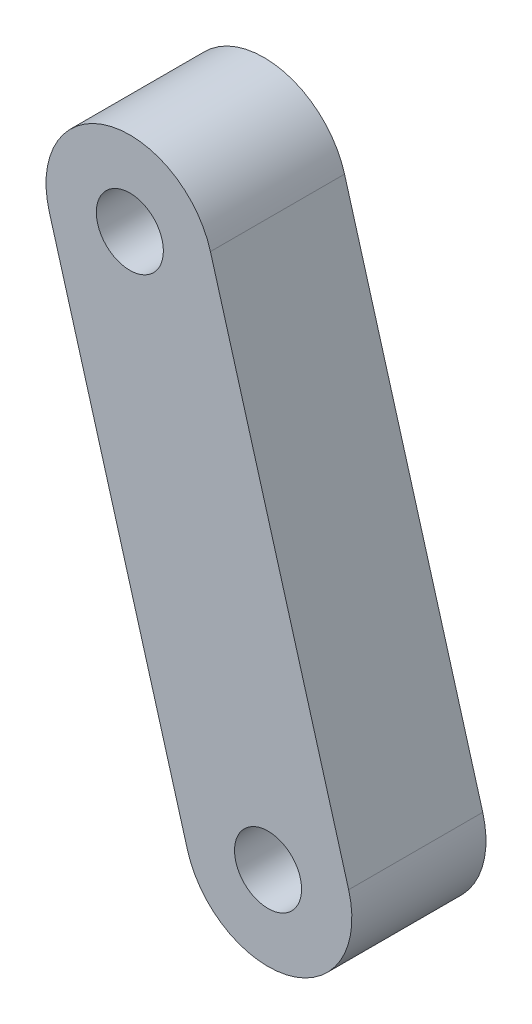
ISO-10303-21;
HEADER;
FILE_DESCRIPTION(('STEP AP214'),'2;1');
FILE_NAME('part.step','',(''),(''),'','','');
FILE_SCHEMA(('AUTOMOTIVE_DESIGN { 1 0 10303 214 1 1 1 1 }'));
ENDSEC;
DATA;
#1=APPLICATION_CONTEXT('core data for automotive mechanical design processes');
#2=APPLICATION_PROTOCOL_DEFINITION('international standard','automotive_design',2000,#1);
#3=PRODUCT_CONTEXT('',#1,'mechanical');
#4=PRODUCT('Part','Part','',(#3));
#5=PRODUCT_RELATED_PRODUCT_CATEGORY('part','',(#4));
#6=PRODUCT_DEFINITION_FORMATION('','',#4);
#7=PRODUCT_DEFINITION_CONTEXT('part definition',#1,'design');
#8=PRODUCT_DEFINITION('design','',#6,#7);
#9=PRODUCT_DEFINITION_SHAPE('','',#8);
#10=(LENGTH_UNIT() NAMED_UNIT(*) SI_UNIT(.MILLI.,.METRE.));
#11=(NAMED_UNIT(*) PLANE_ANGLE_UNIT() SI_UNIT($,.RADIAN.));
#12=(NAMED_UNIT(*) SI_UNIT($,.STERADIAN.) SOLID_ANGLE_UNIT());
#13=UNCERTAINTY_MEASURE_WITH_UNIT(LENGTH_MEASURE(1.E-05),#10,'distance_accuracy_value','');
#14=(GEOMETRIC_REPRESENTATION_CONTEXT(3) GLOBAL_UNCERTAINTY_ASSIGNED_CONTEXT((#13)) GLOBAL_UNIT_ASSIGNED_CONTEXT((#10,
#11,#12)) REPRESENTATION_CONTEXT('',''));
#15=CARTESIAN_POINT('',(0.,0.,0.));
#16=DIRECTION('',(0.,0.,1.));
#17=DIRECTION('',(1.,0.,0.));
#18=AXIS2_PLACEMENT_3D('',#15,#16,#17);
#19=CARTESIAN_POINT('',(21.7327599565873,64.1663539899448,4.));
#20=DIRECTION('',(0.,0.,1.));
#21=DIRECTION('',(1.,0.,0.));
#22=AXIS2_PLACEMENT_3D('',#19,#20,#21);
#23=PLANE('',#22);
#24=CARTESIAN_POINT('',(21.7327599565873,64.1663539899448,4.));
#25=DIRECTION('',(0.,0.,1.));
#26=DIRECTION('',(1.,0.,0.));
#27=AXIS2_PLACEMENT_3D('',#24,#25,#26);
#28=CIRCLE('',#27,2.);
#29=CARTESIAN_POINT('',(23.7327599565873,64.1663539899448,4.));
#30=VERTEX_POINT('',#29);
#31=EDGE_CURVE('E101',#30,#30,#28,.T.);
#32=ORIENTED_EDGE('',*,*,#31,.F.);
#33=EDGE_LOOP('',(#32));
#34=FACE_BOUND('',#33,.T.);
#35=CARTESIAN_POINT('',(21.7327599565873,64.1663539899448,4.));
#36=DIRECTION('',(0.,0.,1.));
#37=DIRECTION('',(1.,0.,0.));
#38=AXIS2_PLACEMENT_3D('',#35,#36,#37);
#39=CIRCLE('',#38,4.99999999999999);
#40=CARTESIAN_POINT('',(26.5402526962941,65.5404040464078,4.));
#41=VERTEX_POINT('',#40);
#42=CARTESIAN_POINT('',(16.9252672168804,62.7923039334817,4.));
#43=VERTEX_POINT('',#42);
#44=EDGE_CURVE('E86',#41,#43,#39,.T.);
#45=ORIENTED_EDGE('',*,*,#44,.T.);
#46=DIRECTION('',(0.274810011292605,-0.961498547941368,0.));
#47=VECTOR('',#46,1.);
#48=CARTESIAN_POINT('',(16.9252672168804,62.7923039334817,4.));
#49=LINE('',#48,#47);
#50=CARTESIAN_POINT('',(25.1695675556586,33.9473474952407,4.));
#51=VERTEX_POINT('',#50);
#52=EDGE_CURVE('E81',#43,#51,#49,.T.);
#53=ORIENTED_EDGE('',*,*,#52,.T.);
#54=CARTESIAN_POINT('',(29.9770602953654,35.3213975517037,4.));
#55=DIRECTION('',(0.,0.,1.));
#56=DIRECTION('',(1.,0.,0.));
#57=AXIS2_PLACEMENT_3D('',#54,#55,#56);
#58=CIRCLE('',#57,5.);
#59=CARTESIAN_POINT('',(34.7845530350722,36.6954476081667,4.));
#60=VERTEX_POINT('',#59);
#61=EDGE_CURVE('E84',#51,#60,#58,.T.);
#62=ORIENTED_EDGE('',*,*,#61,.T.);
#63=DIRECTION('',(-0.274810011292605,0.961498547941368,0.));
#64=VECTOR('',#63,1.);
#65=CARTESIAN_POINT('',(26.5402526962941,65.5404040464078,4.));
#66=LINE('',#65,#64);
#67=EDGE_CURVE('E51',#60,#41,#66,.T.);
#68=ORIENTED_EDGE('',*,*,#67,.T.);
#69=EDGE_LOOP('',(#45,#53,#62,#68));
#70=FACE_BOUND('',#69,.T.);
#71=CARTESIAN_POINT('',(29.9770602953654,35.3213975517037,4.));
#72=DIRECTION('',(0.,0.,1.));
#73=DIRECTION('',(1.,0.,0.));
#74=AXIS2_PLACEMENT_3D('',#71,#72,#73);
#75=CIRCLE('',#74,2.);
#76=CARTESIAN_POINT('',(31.9770602953654,35.3213975517037,4.));
#77=VERTEX_POINT('',#76);
#78=EDGE_CURVE('E116',#77,#77,#75,.T.);
#79=ORIENTED_EDGE('',*,*,#78,.F.);
#80=EDGE_LOOP('',(#79));
#81=FACE_BOUND('',#80,.T.);
#82=ADVANCED_FACE('F34',(#34,#70,#81),#23,.T.);
#83=CARTESIAN_POINT('',(21.7327599565873,64.1663539899448,-4.));
#84=DIRECTION('',(0.,0.,1.));
#85=DIRECTION('',(1.,0.,0.));
#86=AXIS2_PLACEMENT_3D('',#83,#84,#85);
#87=PLANE('',#86);
#88=CARTESIAN_POINT('',(21.7327599565873,64.1663539899448,-4.));
#89=DIRECTION('',(0.,0.,1.));
#90=DIRECTION('',(1.,0.,0.));
#91=AXIS2_PLACEMENT_3D('',#88,#89,#90);
#92=CIRCLE('',#91,4.99999999999999);
#93=CARTESIAN_POINT('',(26.5402526962941,65.5404040464078,-4.));
#94=VERTEX_POINT('',#93);
#95=CARTESIAN_POINT('',(16.9252672168804,62.7923039334817,-4.));
#96=VERTEX_POINT('',#95);
#97=EDGE_CURVE('E98',#94,#96,#92,.T.);
#98=ORIENTED_EDGE('',*,*,#97,.F.);
#99=DIRECTION('',(-0.274810011292605,0.961498547941368,0.));
#100=VECTOR('',#99,1.);
#101=CARTESIAN_POINT('',(26.5402526962941,65.5404040464078,-4.));
#102=LINE('',#101,#100);
#103=CARTESIAN_POINT('',(34.7845530350722,36.6954476081667,-4.));
#104=VERTEX_POINT('',#103);
#105=EDGE_CURVE('E74',#104,#94,#102,.T.);
#106=ORIENTED_EDGE('',*,*,#105,.F.);
#107=CARTESIAN_POINT('',(29.9770602953654,35.3213975517037,-4.));
#108=DIRECTION('',(0.,0.,1.));
#109=DIRECTION('',(1.,0.,0.));
#110=AXIS2_PLACEMENT_3D('',#107,#108,#109);
#111=CIRCLE('',#110,5.);
#112=CARTESIAN_POINT('',(25.1695675556586,33.9473474952407,-4.));
#113=VERTEX_POINT('',#112);
#114=EDGE_CURVE('E68',#113,#104,#111,.T.);
#115=ORIENTED_EDGE('',*,*,#114,.F.);
#116=DIRECTION('',(0.274810011292605,-0.961498547941368,0.));
#117=VECTOR('',#116,1.);
#118=CARTESIAN_POINT('',(16.9252672168804,62.7923039334817,-4.));
#119=LINE('',#118,#117);
#120=EDGE_CURVE('E90',#96,#113,#119,.T.);
#121=ORIENTED_EDGE('',*,*,#120,.F.);
#122=EDGE_LOOP('',(#98,#106,#115,#121));
#123=FACE_BOUND('',#122,.T.);
#124=CARTESIAN_POINT('',(21.7327599565873,64.1663539899448,-4.));
#125=DIRECTION('',(0.,0.,1.));
#126=DIRECTION('',(1.,0.,0.));
#127=AXIS2_PLACEMENT_3D('',#124,#125,#126);
#128=CIRCLE('',#127,2.);
#129=CARTESIAN_POINT('',(23.7327599565873,64.1663539899448,-4.));
#130=VERTEX_POINT('',#129);
#131=EDGE_CURVE('E113',#130,#130,#128,.T.);
#132=ORIENTED_EDGE('',*,*,#131,.T.);
#133=EDGE_LOOP('',(#132));
#134=FACE_BOUND('',#133,.T.);
#135=CARTESIAN_POINT('',(29.9770602953654,35.3213975517037,-4.));
#136=DIRECTION('',(0.,0.,1.));
#137=DIRECTION('',(1.,0.,0.));
#138=AXIS2_PLACEMENT_3D('',#135,#136,#137);
#139=CIRCLE('',#138,2.);
#140=CARTESIAN_POINT('',(31.9770602953654,35.3213975517037,-4.));
#141=VERTEX_POINT('',#140);
#142=EDGE_CURVE('E119',#141,#141,#139,.T.);
#143=ORIENTED_EDGE('',*,*,#142,.T.);
#144=EDGE_LOOP('',(#143));
#145=FACE_BOUND('',#144,.T.);
#146=ADVANCED_FACE('F109',(#123,#134,#145),#87,.F.);
#147=CARTESIAN_POINT('',(21.7327599565873,64.1663539899448,4.));
#148=DIRECTION('',(0.,0.,-1.));
#149=DIRECTION('',(-1.,0.,0.));
#150=AXIS2_PLACEMENT_3D('',#147,#148,#149);
#151=CYLINDRICAL_SURFACE('',#150,4.99999999999999);
#152=ORIENTED_EDGE('',*,*,#97,.T.);
#153=DIRECTION('',(0.,0.,-1.));
#154=VECTOR('',#153,1.);
#155=CARTESIAN_POINT('',(16.9252672168804,62.7923039334817,4.));
#156=LINE('',#155,#154);
#157=EDGE_CURVE('E11',#43,#96,#156,.T.);
#158=ORIENTED_EDGE('',*,*,#157,.F.);
#159=ORIENTED_EDGE('',*,*,#44,.F.);
#160=DIRECTION('',(0.,0.,-1.));
#161=VECTOR('',#160,1.);
#162=CARTESIAN_POINT('',(26.5402526962941,65.5404040464078,4.));
#163=LINE('',#162,#161);
#164=EDGE_CURVE('E94',#41,#94,#163,.T.);
#165=ORIENTED_EDGE('',*,*,#164,.T.);
#166=EDGE_LOOP('',(#152,#158,#159,#165));
#167=FACE_BOUND('',#166,.T.);
#168=ADVANCED_FACE('F36',(#167),#151,.T.);
#169=CARTESIAN_POINT('',(16.9252672168804,62.7923039334817,4.));
#170=DIRECTION('',(0.961498547941368,0.274810011292605,0.));
#171=DIRECTION('',(-0.274810011292605,0.961498547941368,0.));
#172=AXIS2_PLACEMENT_3D('',#169,#170,#171);
#173=PLANE('',#172);
#174=ORIENTED_EDGE('',*,*,#120,.T.);
#175=DIRECTION('',(0.,0.,-1.));
#176=VECTOR('',#175,1.);
#177=CARTESIAN_POINT('',(25.1695675556586,33.9473474952407,4.));
#178=LINE('',#177,#176);
#179=EDGE_CURVE('E43',#51,#113,#178,.T.);
#180=ORIENTED_EDGE('',*,*,#179,.F.);
#181=ORIENTED_EDGE('',*,*,#52,.F.);
#182=ORIENTED_EDGE('',*,*,#157,.T.);
#183=EDGE_LOOP('',(#174,#180,#181,#182));
#184=FACE_BOUND('',#183,.T.);
#185=ADVANCED_FACE('F89',(#184),#173,.F.);
#186=CARTESIAN_POINT('',(29.9770602953654,35.3213975517037,4.));
#187=DIRECTION('',(0.,0.,-1.));
#188=DIRECTION('',(-1.,0.,0.));
#189=AXIS2_PLACEMENT_3D('',#186,#187,#188);
#190=CYLINDRICAL_SURFACE('',#189,5.);
#191=ORIENTED_EDGE('',*,*,#114,.T.);
#192=DIRECTION('',(0.,0.,-1.));
#193=VECTOR('',#192,1.);
#194=CARTESIAN_POINT('',(34.7845530350722,36.6954476081667,4.));
#195=LINE('',#194,#193);
#196=EDGE_CURVE('E91',#60,#104,#195,.T.);
#197=ORIENTED_EDGE('',*,*,#196,.F.);
#198=ORIENTED_EDGE('',*,*,#61,.F.);
#199=ORIENTED_EDGE('',*,*,#179,.T.);
#200=EDGE_LOOP('',(#191,#197,#198,#199));
#201=FACE_BOUND('',#200,.T.);
#202=ADVANCED_FACE('F92',(#201),#190,.T.);
#203=CARTESIAN_POINT('',(26.5402526962941,65.5404040464078,4.));
#204=DIRECTION('',(-0.961498547941368,-0.274810011292605,0.));
#205=DIRECTION('',(0.274810011292605,-0.961498547941368,0.));
#206=AXIS2_PLACEMENT_3D('',#203,#204,#205);
#207=PLANE('',#206);
#208=ORIENTED_EDGE('',*,*,#105,.T.);
#209=ORIENTED_EDGE('',*,*,#164,.F.);
#210=ORIENTED_EDGE('',*,*,#67,.F.);
#211=ORIENTED_EDGE('',*,*,#196,.T.);
#212=EDGE_LOOP('',(#208,#209,#210,#211));
#213=FACE_BOUND('',#212,.T.);
#214=ADVANCED_FACE('F106',(#213),#207,.F.);
#215=CARTESIAN_POINT('',(21.7327599565873,64.1663539899448,4.));
#216=DIRECTION('',(0.,0.,-1.));
#217=DIRECTION('',(-1.,0.,0.));
#218=AXIS2_PLACEMENT_3D('',#215,#216,#217);
#219=CYLINDRICAL_SURFACE('',#218,2.);
#220=ORIENTED_EDGE('',*,*,#31,.T.);
#221=EDGE_LOOP('',(#220));
#222=FACE_BOUND('',#221,.T.);
#223=ORIENTED_EDGE('',*,*,#131,.F.);
#224=EDGE_LOOP('',(#223));
#225=FACE_BOUND('',#224,.T.);
#226=ADVANCED_FACE('F136',(#222,#225),#219,.F.);
#227=CARTESIAN_POINT('',(29.9770602953654,35.3213975517037,4.));
#228=DIRECTION('',(0.,0.,-1.));
#229=DIRECTION('',(-1.,0.,0.));
#230=AXIS2_PLACEMENT_3D('',#227,#228,#229);
#231=CYLINDRICAL_SURFACE('',#230,2.);
#232=ORIENTED_EDGE('',*,*,#78,.T.);
#233=EDGE_LOOP('',(#232));
#234=FACE_BOUND('',#233,.T.);
#235=ORIENTED_EDGE('',*,*,#142,.F.);
#236=EDGE_LOOP('',(#235));
#237=FACE_BOUND('',#236,.T.);
#238=ADVANCED_FACE('F125',(#234,#237),#231,.F.);
#239=CLOSED_SHELL('',(#82,#146,#168,#185,#202,#214,#226,#238));
#240=MANIFOLD_SOLID_BREP('B2',#239);
#241=ADVANCED_BREP_SHAPE_REPRESENTATION('',(#18,#240),#14);
#242=SHAPE_DEFINITION_REPRESENTATION(#9,#241);
ENDSEC;
END-ISO-10303-21;
